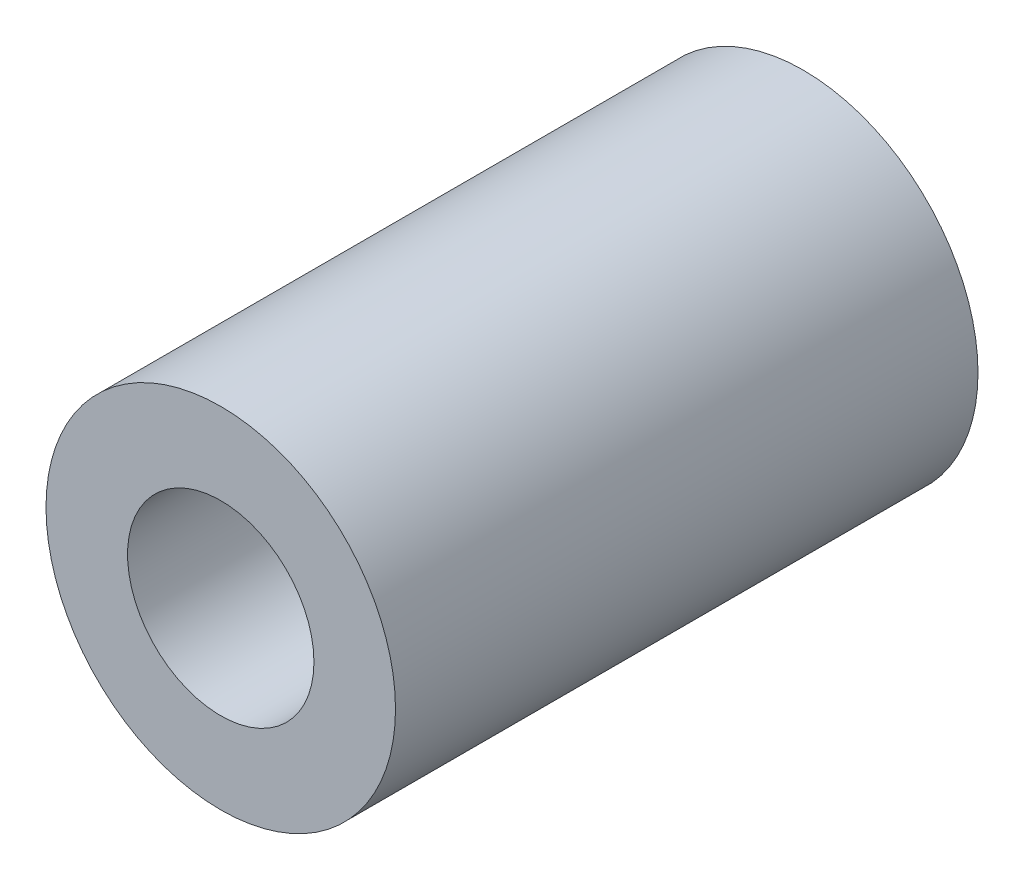
ISO-10303-21;
HEADER;
FILE_DESCRIPTION(('STEP AP214'),'2;1');
FILE_NAME('part.step','',(''),(''),'','','');
FILE_SCHEMA(('AUTOMOTIVE_DESIGN { 1 0 10303 214 1 1 1 1 }'));
ENDSEC;
DATA;
#1=APPLICATION_CONTEXT('core data for automotive mechanical design processes');
#2=APPLICATION_PROTOCOL_DEFINITION('international standard','automotive_design',2000,#1);
#3=PRODUCT_CONTEXT('',#1,'mechanical');
#4=PRODUCT('Part','Part','',(#3));
#5=PRODUCT_RELATED_PRODUCT_CATEGORY('part','',(#4));
#6=PRODUCT_DEFINITION_FORMATION('','',#4);
#7=PRODUCT_DEFINITION_CONTEXT('part definition',#1,'design');
#8=PRODUCT_DEFINITION('design','',#6,#7);
#9=PRODUCT_DEFINITION_SHAPE('','',#8);
#10=(LENGTH_UNIT() NAMED_UNIT(*) SI_UNIT(.MILLI.,.METRE.));
#11=(NAMED_UNIT(*) PLANE_ANGLE_UNIT() SI_UNIT($,.RADIAN.));
#12=(NAMED_UNIT(*) SI_UNIT($,.STERADIAN.) SOLID_ANGLE_UNIT());
#13=UNCERTAINTY_MEASURE_WITH_UNIT(LENGTH_MEASURE(1.E-05),#10,'distance_accuracy_value','');
#14=(GEOMETRIC_REPRESENTATION_CONTEXT(3) GLOBAL_UNCERTAINTY_ASSIGNED_CONTEXT((#13)) GLOBAL_UNIT_ASSIGNED_CONTEXT((#10,
#11,#12)) REPRESENTATION_CONTEXT('',''));
#15=CARTESIAN_POINT('',(0.,0.,0.));
#16=DIRECTION('',(0.,0.,1.));
#17=DIRECTION('',(1.,0.,0.));
#18=AXIS2_PLACEMENT_3D('',#15,#16,#17);
#19=CARTESIAN_POINT('',(0.,0.,15.875));
#20=DIRECTION('',(0.,0.,1.));
#21=DIRECTION('',(1.,0.,0.));
#22=AXIS2_PLACEMENT_3D('',#19,#20,#21);
#23=PLANE('',#22);
#24=CARTESIAN_POINT('',(0.,0.,15.875));
#25=DIRECTION('',(0.,0.,1.));
#26=DIRECTION('',(1.,0.,0.));
#27=AXIS2_PLACEMENT_3D('',#24,#25,#26);
#28=CIRCLE('',#27,4.7625);
#29=CARTESIAN_POINT('',(4.7625,0.,15.875));
#30=VERTEX_POINT('',#29);
#31=EDGE_CURVE('E10',#30,#30,#28,.T.);
#32=ORIENTED_EDGE('',*,*,#31,.T.);
#33=EDGE_LOOP('',(#32));
#34=FACE_BOUND('',#33,.T.);
#35=CARTESIAN_POINT('',(0.,0.,15.875));
#36=DIRECTION('',(0.,0.,1.));
#37=DIRECTION('',(1.,0.,0.));
#38=AXIS2_PLACEMENT_3D('',#35,#36,#37);
#39=CIRCLE('',#38,2.54);
#40=CARTESIAN_POINT('',(2.54,0.,15.875));
#41=VERTEX_POINT('',#40);
#42=EDGE_CURVE('E41',#41,#41,#39,.T.);
#43=ORIENTED_EDGE('',*,*,#42,.F.);
#44=EDGE_LOOP('',(#43));
#45=FACE_BOUND('',#44,.T.);
#46=ADVANCED_FACE('F30',(#34,#45),#23,.T.);
#47=CARTESIAN_POINT('',(0.,0.,0.));
#48=DIRECTION('',(0.,0.,1.));
#49=DIRECTION('',(1.,0.,0.));
#50=AXIS2_PLACEMENT_3D('',#47,#48,#49);
#51=PLANE('',#50);
#52=CARTESIAN_POINT('',(0.,0.,0.));
#53=DIRECTION('',(0.,0.,1.));
#54=DIRECTION('',(1.,0.,0.));
#55=AXIS2_PLACEMENT_3D('',#52,#53,#54);
#56=CIRCLE('',#55,4.7625);
#57=CARTESIAN_POINT('',(4.7625,0.,0.));
#58=VERTEX_POINT('',#57);
#59=EDGE_CURVE('E34',#58,#58,#56,.T.);
#60=ORIENTED_EDGE('',*,*,#59,.F.);
#61=EDGE_LOOP('',(#60));
#62=FACE_BOUND('',#61,.T.);
#63=CARTESIAN_POINT('',(0.,0.,0.));
#64=DIRECTION('',(0.,0.,1.));
#65=DIRECTION('',(1.,0.,0.));
#66=AXIS2_PLACEMENT_3D('',#63,#64,#65);
#67=CIRCLE('',#66,2.54);
#68=CARTESIAN_POINT('',(2.54,0.,0.));
#69=VERTEX_POINT('',#68);
#70=EDGE_CURVE('E43',#69,#69,#67,.T.);
#71=ORIENTED_EDGE('',*,*,#70,.T.);
#72=EDGE_LOOP('',(#71));
#73=FACE_BOUND('',#72,.T.);
#74=ADVANCED_FACE('F53',(#62,#73),#51,.F.);
#75=CARTESIAN_POINT('',(0.,0.,15.875));
#76=DIRECTION('',(0.,0.,-1.));
#77=DIRECTION('',(-1.,0.,0.));
#78=AXIS2_PLACEMENT_3D('',#75,#76,#77);
#79=CYLINDRICAL_SURFACE('',#78,4.7625);
#80=ORIENTED_EDGE('',*,*,#31,.F.);
#81=EDGE_LOOP('',(#80));
#82=FACE_BOUND('',#81,.T.);
#83=ORIENTED_EDGE('',*,*,#59,.T.);
#84=EDGE_LOOP('',(#83));
#85=FACE_BOUND('',#84,.T.);
#86=ADVANCED_FACE('F32',(#82,#85),#79,.T.);
#87=CARTESIAN_POINT('',(0.,0.,15.875));
#88=DIRECTION('',(0.,0.,-1.));
#89=DIRECTION('',(-1.,0.,0.));
#90=AXIS2_PLACEMENT_3D('',#87,#88,#89);
#91=CYLINDRICAL_SURFACE('',#90,2.54);
#92=ORIENTED_EDGE('',*,*,#42,.T.);
#93=EDGE_LOOP('',(#92));
#94=FACE_BOUND('',#93,.T.);
#95=ORIENTED_EDGE('',*,*,#70,.F.);
#96=EDGE_LOOP('',(#95));
#97=FACE_BOUND('',#96,.T.);
#98=ADVANCED_FACE('F49',(#94,#97),#91,.F.);
#99=CLOSED_SHELL('',(#46,#74,#86,#98));
#100=MANIFOLD_SOLID_BREP('B2',#99);
#101=ADVANCED_BREP_SHAPE_REPRESENTATION('',(#18,#100),#14);
#102=SHAPE_DEFINITION_REPRESENTATION(#9,#101);
ENDSEC;
END-ISO-10303-21;
